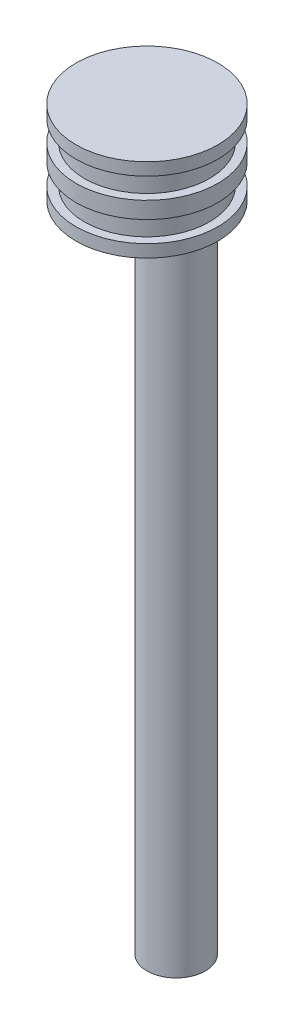
ISO-10303-21;
HEADER;
FILE_DESCRIPTION(('STEP AP214'),'2;1');
FILE_NAME('part.step','',(''),(''),'','','');
FILE_SCHEMA(('AUTOMOTIVE_DESIGN { 1 0 10303 214 1 1 1 1 }'));
ENDSEC;
DATA;
#1=APPLICATION_CONTEXT('core data for automotive mechanical design processes');
#2=APPLICATION_PROTOCOL_DEFINITION('international standard','automotive_design',2000,#1);
#3=PRODUCT_CONTEXT('',#1,'mechanical');
#4=PRODUCT('Part','Part','',(#3));
#5=PRODUCT_RELATED_PRODUCT_CATEGORY('part','',(#4));
#6=PRODUCT_DEFINITION_FORMATION('','',#4);
#7=PRODUCT_DEFINITION_CONTEXT('part definition',#1,'design');
#8=PRODUCT_DEFINITION('design','',#6,#7);
#9=PRODUCT_DEFINITION_SHAPE('','',#8);
#10=(LENGTH_UNIT() NAMED_UNIT(*) SI_UNIT(.MILLI.,.METRE.));
#11=(NAMED_UNIT(*) PLANE_ANGLE_UNIT() SI_UNIT($,.RADIAN.));
#12=(NAMED_UNIT(*) SI_UNIT($,.STERADIAN.) SOLID_ANGLE_UNIT());
#13=UNCERTAINTY_MEASURE_WITH_UNIT(LENGTH_MEASURE(1.E-05),#10,'distance_accuracy_value','');
#14=(GEOMETRIC_REPRESENTATION_CONTEXT(3) GLOBAL_UNCERTAINTY_ASSIGNED_CONTEXT((#13)) GLOBAL_UNIT_ASSIGNED_CONTEXT((#10,
#11,#12)) REPRESENTATION_CONTEXT('',''));
#15=CARTESIAN_POINT('',(0.,0.,0.));
#16=DIRECTION('',(0.,0.,1.));
#17=DIRECTION('',(1.,0.,0.));
#18=AXIS2_PLACEMENT_3D('',#15,#16,#17);
#19=CARTESIAN_POINT('',(0.,10.,0.));
#20=DIRECTION('',(0.,-1.,0.));
#21=DIRECTION('',(0.,0.,-1.));
#22=AXIS2_PLACEMENT_3D('',#19,#20,#21);
#23=CYLINDRICAL_SURFACE('',#22,8.5);
#24=CARTESIAN_POINT('',(0.,8.5,0.));
#25=DIRECTION('',(0.,1.,0.));
#26=DIRECTION('',(0.,0.,1.));
#27=AXIS2_PLACEMENT_3D('',#24,#25,#26);
#28=CIRCLE('',#27,8.5);
#29=CARTESIAN_POINT('',(0.,8.5,8.5));
#30=VERTEX_POINT('',#29);
#31=EDGE_CURVE('E47',#30,#30,#28,.T.);
#32=ORIENTED_EDGE('',*,*,#31,.T.);
#33=EDGE_LOOP('',(#32));
#34=FACE_BOUND('',#33,.T.);
#35=CARTESIAN_POINT('',(0.,10.,0.));
#36=DIRECTION('',(0.,1.,0.));
#37=DIRECTION('',(0.,0.,1.));
#38=AXIS2_PLACEMENT_3D('',#35,#36,#37);
#39=CIRCLE('',#38,8.5);
#40=CARTESIAN_POINT('',(0.,10.,8.5));
#41=VERTEX_POINT('',#40);
#42=EDGE_CURVE('E11',#41,#41,#39,.T.);
#43=ORIENTED_EDGE('',*,*,#42,.F.);
#44=EDGE_LOOP('',(#43));
#45=FACE_BOUND('',#44,.T.);
#46=ADVANCED_FACE('F44',(#34,#45),#23,.T.);
#47=CARTESIAN_POINT('',(0.,10.,0.));
#48=DIRECTION('',(0.,1.,0.));
#49=DIRECTION('',(0.,0.,1.));
#50=AXIS2_PLACEMENT_3D('',#47,#48,#49);
#51=PLANE('',#50);
#52=ORIENTED_EDGE('',*,*,#42,.T.);
#53=EDGE_LOOP('',(#52));
#54=FACE_BOUND('',#53,.T.);
#55=ADVANCED_FACE('F60',(#54),#51,.T.);
#56=CARTESIAN_POINT('',(0.,8.5,0.));
#57=DIRECTION('',(0.,1.,0.));
#58=DIRECTION('',(0.,0.,1.));
#59=AXIS2_PLACEMENT_3D('',#56,#57,#58);
#60=PLANE('',#59);
#61=ORIENTED_EDGE('',*,*,#31,.F.);
#62=EDGE_LOOP('',(#61));
#63=FACE_BOUND('',#62,.T.);
#64=ADVANCED_FACE('F58',(#63),#60,.F.);
#65=CLOSED_SHELL('',(#46,#55,#64));
#66=MANIFOLD_SOLID_BREP('B2',#65);
#67=CARTESIAN_POINT('',(0.,4.,0.));
#68=DIRECTION('',(0.,1.,0.));
#69=DIRECTION('',(0.,0.,1.));
#70=AXIS2_PLACEMENT_3D('',#67,#68,#69);
#71=PLANE('',#70);
#72=CARTESIAN_POINT('',(0.,4.,0.));
#73=DIRECTION('',(0.,1.,0.));
#74=DIRECTION('',(0.,0.,1.));
#75=AXIS2_PLACEMENT_3D('',#72,#73,#74);
#76=CIRCLE('',#75,8.5);
#77=CARTESIAN_POINT('',(0.,4.,8.5));
#78=VERTEX_POINT('',#77);
#79=EDGE_CURVE('E43',#78,#78,#76,.T.);
#80=ORIENTED_EDGE('',*,*,#79,.F.);
#81=EDGE_LOOP('',(#80));
#82=FACE_BOUND('',#81,.T.);
#83=ADVANCED_FACE('F98',(#82),#71,.F.);
#84=CARTESIAN_POINT('',(0.,10.,0.));
#85=DIRECTION('',(0.,-1.,0.));
#86=DIRECTION('',(0.,0.,-1.));
#87=AXIS2_PLACEMENT_3D('',#84,#85,#86);
#88=CYLINDRICAL_SURFACE('',#87,8.5);
#89=ORIENTED_EDGE('',*,*,#79,.T.);
#90=EDGE_LOOP('',(#89));
#91=FACE_BOUND('',#90,.T.);
#92=CARTESIAN_POINT('',(0.,6.,0.));
#93=DIRECTION('',(0.,1.,0.));
#94=DIRECTION('',(0.,0.,1.));
#95=AXIS2_PLACEMENT_3D('',#92,#93,#94);
#96=CIRCLE('',#95,8.5);
#97=CARTESIAN_POINT('',(0.,6.,8.5));
#98=VERTEX_POINT('',#97);
#99=EDGE_CURVE('E105',#98,#98,#96,.T.);
#100=ORIENTED_EDGE('',*,*,#99,.F.);
#101=EDGE_LOOP('',(#100));
#102=FACE_BOUND('',#101,.T.);
#103=ADVANCED_FACE('F100',(#91,#102),#88,.T.);
#104=CARTESIAN_POINT('',(0.,6.,0.));
#105=DIRECTION('',(0.,1.,0.));
#106=DIRECTION('',(0.,0.,1.));
#107=AXIS2_PLACEMENT_3D('',#104,#105,#106);
#108=PLANE('',#107);
#109=ORIENTED_EDGE('',*,*,#99,.T.);
#110=EDGE_LOOP('',(#109));
#111=FACE_BOUND('',#110,.T.);
#112=ADVANCED_FACE('F111',(#111),#108,.T.);
#113=CLOSED_SHELL('',(#83,#103,#112));
#114=MANIFOLD_SOLID_BREP('B6',#113);
#115=CARTESIAN_POINT('',(0.,0.,0.));
#116=DIRECTION('',(0.,1.,0.));
#117=DIRECTION('',(0.,0.,1.));
#118=AXIS2_PLACEMENT_3D('',#115,#116,#117);
#119=PLANE('',#118);
#120=CARTESIAN_POINT('',(0.,0.,-3.5));
#121=DIRECTION('',(0.,-1.,0.));
#122=DIRECTION('',(0.,0.,-1.));
#123=AXIS2_PLACEMENT_3D('',#120,#121,#122);
#124=CIRCLE('',#123,3.5);
#125=CARTESIAN_POINT('',(0.,0.,-7.));
#126=VERTEX_POINT('',#125);
#127=EDGE_CURVE('E97',#126,#126,#124,.T.);
#128=ORIENTED_EDGE('',*,*,#127,.F.);
#129=EDGE_LOOP('',(#128));
#130=FACE_BOUND('',#129,.T.);
#131=CARTESIAN_POINT('',(0.,0.,0.));
#132=DIRECTION('',(0.,1.,0.));
#133=DIRECTION('',(0.,0.,1.));
#134=AXIS2_PLACEMENT_3D('',#131,#132,#133);
#135=CIRCLE('',#134,8.5);
#136=CARTESIAN_POINT('',(0.,0.,8.5));
#137=VERTEX_POINT('',#136);
#138=EDGE_CURVE('E153',#137,#137,#135,.T.);
#139=ORIENTED_EDGE('',*,*,#138,.F.);
#140=EDGE_LOOP('',(#139));
#141=FACE_BOUND('',#140,.T.);
#142=ADVANCED_FACE('F145',(#130,#141),#119,.F.);
#143=CARTESIAN_POINT('',(0.,10.,0.));
#144=DIRECTION('',(0.,-1.,0.));
#145=DIRECTION('',(0.,0.,-1.));
#146=AXIS2_PLACEMENT_3D('',#143,#144,#145);
#147=CYLINDRICAL_SURFACE('',#146,8.5);
#148=ORIENTED_EDGE('',*,*,#138,.T.);
#149=EDGE_LOOP('',(#148));
#150=FACE_BOUND('',#149,.T.);
#151=CARTESIAN_POINT('',(0.,1.5,0.));
#152=DIRECTION('',(0.,1.,0.));
#153=DIRECTION('',(0.,0.,1.));
#154=AXIS2_PLACEMENT_3D('',#151,#152,#153);
#155=CIRCLE('',#154,8.5);
#156=CARTESIAN_POINT('',(0.,1.5,8.5));
#157=VERTEX_POINT('',#156);
#158=EDGE_CURVE('E158',#157,#157,#155,.T.);
#159=ORIENTED_EDGE('',*,*,#158,.F.);
#160=EDGE_LOOP('',(#159));
#161=FACE_BOUND('',#160,.T.);
#162=ADVANCED_FACE('F147',(#150,#161),#147,.T.);
#163=CARTESIAN_POINT('',(0.,1.5,0.));
#164=DIRECTION('',(0.,1.,0.));
#165=DIRECTION('',(0.,0.,1.));
#166=AXIS2_PLACEMENT_3D('',#163,#164,#165);
#167=PLANE('',#166);
#168=CARTESIAN_POINT('',(0.,1.5,0.));
#169=DIRECTION('',(0.,1.,0.));
#170=DIRECTION('',(0.,0.,1.));
#171=AXIS2_PLACEMENT_3D('',#168,#169,#170);
#172=CIRCLE('',#171,7.5);
#173=CARTESIAN_POINT('',(0.,1.5,7.5));
#174=VERTEX_POINT('',#173);
#175=EDGE_CURVE('E149',#174,#174,#172,.F.);
#176=ORIENTED_EDGE('',*,*,#175,.T.);
#177=EDGE_LOOP('',(#176));
#178=FACE_BOUND('',#177,.T.);
#179=ORIENTED_EDGE('',*,*,#158,.T.);
#180=EDGE_LOOP('',(#179));
#181=FACE_BOUND('',#180,.T.);
#182=ADVANCED_FACE('F171',(#178,#181),#167,.T.);
#183=CARTESIAN_POINT('',(0.,9.,0.));
#184=DIRECTION('',(0.,-1.,0.));
#185=DIRECTION('',(0.,0.,-1.));
#186=AXIS2_PLACEMENT_3D('',#183,#184,#185);
#187=CYLINDRICAL_SURFACE('',#186,7.5);
#188=ORIENTED_EDGE('',*,*,#175,.F.);
#189=EDGE_LOOP('',(#188));
#190=FACE_BOUND('',#189,.T.);
#191=CARTESIAN_POINT('',(0.,9.,0.));
#192=DIRECTION('',(0.,1.,0.));
#193=DIRECTION('',(0.,0.,1.));
#194=AXIS2_PLACEMENT_3D('',#191,#192,#193);
#195=CIRCLE('',#194,7.5);
#196=CARTESIAN_POINT('',(0.,9.,7.5));
#197=VERTEX_POINT('',#196);
#198=EDGE_CURVE('E162',#197,#197,#195,.T.);
#199=ORIENTED_EDGE('',*,*,#198,.F.);
#200=EDGE_LOOP('',(#199));
#201=FACE_BOUND('',#200,.T.);
#202=ADVANCED_FACE('F173',(#190,#201),#187,.T.);
#203=CARTESIAN_POINT('',(0.,9.,0.));
#204=DIRECTION('',(0.,1.,0.));
#205=DIRECTION('',(0.,0.,1.));
#206=AXIS2_PLACEMENT_3D('',#203,#204,#205);
#207=PLANE('',#206);
#208=ORIENTED_EDGE('',*,*,#198,.T.);
#209=EDGE_LOOP('',(#208));
#210=FACE_BOUND('',#209,.T.);
#211=ADVANCED_FACE('F176',(#210),#207,.T.);
#212=CARTESIAN_POINT('',(0.,-80.,-3.5));
#213=DIRECTION('',(0.,1.,0.));
#214=DIRECTION('',(0.,0.,1.));
#215=AXIS2_PLACEMENT_3D('',#212,#213,#214);
#216=CYLINDRICAL_SURFACE('',#215,3.5);
#217=CARTESIAN_POINT('',(0.,-80.,-3.5));
#218=DIRECTION('',(0.,-1.,0.));
#219=DIRECTION('',(0.,0.,-1.));
#220=AXIS2_PLACEMENT_3D('',#217,#218,#219);
#221=CIRCLE('',#220,3.5);
#222=CARTESIAN_POINT('',(0.,-80.,-7.));
#223=VERTEX_POINT('',#222);
#224=EDGE_CURVE('E161',#223,#223,#221,.T.);
#225=ORIENTED_EDGE('',*,*,#224,.F.);
#226=EDGE_LOOP('',(#225));
#227=FACE_BOUND('',#226,.T.);
#228=ORIENTED_EDGE('',*,*,#127,.T.);
#229=EDGE_LOOP('',(#228));
#230=FACE_BOUND('',#229,.T.);
#231=ADVANCED_FACE('F181',(#227,#230),#216,.T.);
#232=CARTESIAN_POINT('',(0.,-80.,-3.5));
#233=DIRECTION('',(0.,-1.,0.));
#234=DIRECTION('',(0.,0.,-1.));
#235=AXIS2_PLACEMENT_3D('',#232,#233,#234);
#236=PLANE('',#235);
#237=ORIENTED_EDGE('',*,*,#224,.T.);
#238=EDGE_LOOP('',(#237));
#239=FACE_BOUND('',#238,.T.);
#240=ADVANCED_FACE('F186',(#239),#236,.T.);
#241=CLOSED_SHELL('',(#142,#162,#182,#202,#211,#231,#240));
#242=MANIFOLD_SOLID_BREP('B38',#241);
#243=ADVANCED_BREP_SHAPE_REPRESENTATION('',(#18,#66,#114,#242),#14);
#244=SHAPE_DEFINITION_REPRESENTATION(#9,#243);
ENDSEC;
END-ISO-10303-21;
